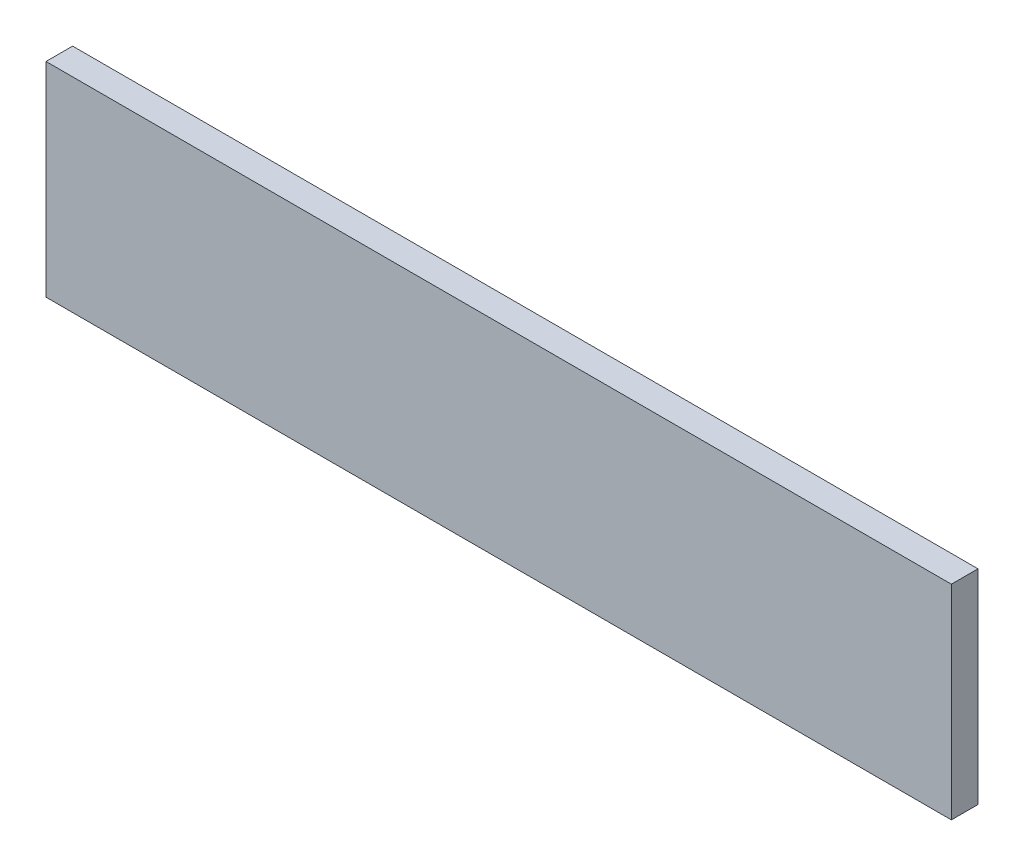
ISO-10303-21;
HEADER;
FILE_DESCRIPTION(('STEP AP214'),'2;1');
FILE_NAME('part.step','',(''),(''),'','','');
FILE_SCHEMA(('AUTOMOTIVE_DESIGN { 1 0 10303 214 1 1 1 1 }'));
ENDSEC;
DATA;
#1=APPLICATION_CONTEXT('core data for automotive mechanical design processes');
#2=APPLICATION_PROTOCOL_DEFINITION('international standard','automotive_design',2000,#1);
#3=PRODUCT_CONTEXT('',#1,'mechanical');
#4=PRODUCT('Part','Part','',(#3));
#5=PRODUCT_RELATED_PRODUCT_CATEGORY('part','',(#4));
#6=PRODUCT_DEFINITION_FORMATION('','',#4);
#7=PRODUCT_DEFINITION_CONTEXT('part definition',#1,'design');
#8=PRODUCT_DEFINITION('design','',#6,#7);
#9=PRODUCT_DEFINITION_SHAPE('','',#8);
#10=(LENGTH_UNIT() NAMED_UNIT(*) SI_UNIT(.MILLI.,.METRE.));
#11=(NAMED_UNIT(*) PLANE_ANGLE_UNIT() SI_UNIT($,.RADIAN.));
#12=(NAMED_UNIT(*) SI_UNIT($,.STERADIAN.) SOLID_ANGLE_UNIT());
#13=UNCERTAINTY_MEASURE_WITH_UNIT(LENGTH_MEASURE(1.E-05),#10,'distance_accuracy_value','');
#14=(GEOMETRIC_REPRESENTATION_CONTEXT(3) GLOBAL_UNCERTAINTY_ASSIGNED_CONTEXT((#13)) GLOBAL_UNIT_ASSIGNED_CONTEXT((#10,
#11,#12)) REPRESENTATION_CONTEXT('',''));
#15=CARTESIAN_POINT('',(0.,0.,0.));
#16=DIRECTION('',(0.,0.,1.));
#17=DIRECTION('',(1.,0.,0.));
#18=AXIS2_PLACEMENT_3D('',#15,#16,#17);
#19=CARTESIAN_POINT('',(0.,0.,19.05));
#20=DIRECTION('',(1.,0.,0.));
#21=DIRECTION('',(0.,0.,-1.));
#22=AXIS2_PLACEMENT_3D('',#19,#20,#21);
#23=PLANE('',#22);
#24=DIRECTION('',(0.,-1.,0.));
#25=VECTOR('',#24,1.);
#26=CARTESIAN_POINT('',(0.,0.,0.));
#27=LINE('',#26,#25);
#28=CARTESIAN_POINT('',(0.,146.05,0.));
#29=VERTEX_POINT('',#28);
#30=CARTESIAN_POINT('',(0.,0.,0.));
#31=VERTEX_POINT('',#30);
#32=EDGE_CURVE('E96',#29,#31,#27,.T.);
#33=ORIENTED_EDGE('',*,*,#32,.T.);
#34=DIRECTION('',(0.,0.,-1.));
#35=VECTOR('',#34,1.);
#36=CARTESIAN_POINT('',(0.,0.,19.05));
#37=LINE('',#36,#35);
#38=CARTESIAN_POINT('',(0.,0.,19.05));
#39=VERTEX_POINT('',#38);
#40=EDGE_CURVE('E11',#39,#31,#37,.T.);
#41=ORIENTED_EDGE('',*,*,#40,.F.);
#42=DIRECTION('',(0.,-1.,0.));
#43=VECTOR('',#42,1.);
#44=CARTESIAN_POINT('',(0.,0.,19.05));
#45=LINE('',#44,#43);
#46=CARTESIAN_POINT('',(0.,146.05,19.05));
#47=VERTEX_POINT('',#46);
#48=EDGE_CURVE('E84',#47,#39,#45,.T.);
#49=ORIENTED_EDGE('',*,*,#48,.F.);
#50=DIRECTION('',(0.,0.,-1.));
#51=VECTOR('',#50,1.);
#52=CARTESIAN_POINT('',(0.,146.05,19.05));
#53=LINE('',#52,#51);
#54=EDGE_CURVE('E92',#47,#29,#53,.T.);
#55=ORIENTED_EDGE('',*,*,#54,.T.);
#56=EDGE_LOOP('',(#33,#41,#49,#55));
#57=FACE_BOUND('',#56,.T.);
#58=ADVANCED_FACE('F33',(#57),#23,.F.);
#59=CARTESIAN_POINT('',(0.,0.,19.05));
#60=DIRECTION('',(0.,1.,0.));
#61=DIRECTION('',(0.,0.,1.));
#62=AXIS2_PLACEMENT_3D('',#59,#60,#61);
#63=PLANE('',#62);
#64=DIRECTION('',(1.,0.,0.));
#65=VECTOR('',#64,1.);
#66=CARTESIAN_POINT('',(0.,0.,0.));
#67=LINE('',#66,#65);
#68=CARTESIAN_POINT('',(647.7,0.,0.));
#69=VERTEX_POINT('',#68);
#70=EDGE_CURVE('E88',#31,#69,#67,.T.);
#71=ORIENTED_EDGE('',*,*,#70,.T.);
#72=DIRECTION('',(0.,0.,-1.));
#73=VECTOR('',#72,1.);
#74=CARTESIAN_POINT('',(647.7,0.,19.05));
#75=LINE('',#74,#73);
#76=CARTESIAN_POINT('',(647.7,0.,19.05));
#77=VERTEX_POINT('',#76);
#78=EDGE_CURVE('E41',#77,#69,#75,.T.);
#79=ORIENTED_EDGE('',*,*,#78,.F.);
#80=DIRECTION('',(1.,0.,0.));
#81=VECTOR('',#80,1.);
#82=CARTESIAN_POINT('',(0.,0.,19.05));
#83=LINE('',#82,#81);
#84=EDGE_CURVE('E79',#39,#77,#83,.T.);
#85=ORIENTED_EDGE('',*,*,#84,.F.);
#86=ORIENTED_EDGE('',*,*,#40,.T.);
#87=EDGE_LOOP('',(#71,#79,#85,#86));
#88=FACE_BOUND('',#87,.T.);
#89=ADVANCED_FACE('F87',(#88),#63,.F.);
#90=CARTESIAN_POINT('',(647.7,0.,19.05));
#91=DIRECTION('',(-1.,0.,0.));
#92=DIRECTION('',(0.,0.,1.));
#93=AXIS2_PLACEMENT_3D('',#90,#91,#92);
#94=PLANE('',#93);
#95=DIRECTION('',(0.,1.,0.));
#96=VECTOR('',#95,1.);
#97=CARTESIAN_POINT('',(647.7,0.,0.));
#98=LINE('',#97,#96);
#99=CARTESIAN_POINT('',(647.7,146.05,0.));
#100=VERTEX_POINT('',#99);
#101=EDGE_CURVE('E66',#69,#100,#98,.T.);
#102=ORIENTED_EDGE('',*,*,#101,.T.);
#103=DIRECTION('',(0.,0.,-1.));
#104=VECTOR('',#103,1.);
#105=CARTESIAN_POINT('',(647.7,146.05,19.05));
#106=LINE('',#105,#104);
#107=CARTESIAN_POINT('',(647.7,146.05,19.05));
#108=VERTEX_POINT('',#107);
#109=EDGE_CURVE('E89',#108,#100,#106,.T.);
#110=ORIENTED_EDGE('',*,*,#109,.F.);
#111=DIRECTION('',(0.,1.,0.));
#112=VECTOR('',#111,1.);
#113=CARTESIAN_POINT('',(647.7,0.,19.05));
#114=LINE('',#113,#112);
#115=EDGE_CURVE('E82',#77,#108,#114,.T.);
#116=ORIENTED_EDGE('',*,*,#115,.F.);
#117=ORIENTED_EDGE('',*,*,#78,.T.);
#118=EDGE_LOOP('',(#102,#110,#116,#117));
#119=FACE_BOUND('',#118,.T.);
#120=ADVANCED_FACE('F90',(#119),#94,.F.);
#121=CARTESIAN_POINT('',(0.,146.05,19.05));
#122=DIRECTION('',(0.,-1.,0.));
#123=DIRECTION('',(0.,0.,-1.));
#124=AXIS2_PLACEMENT_3D('',#121,#122,#123);
#125=PLANE('',#124);
#126=DIRECTION('',(-1.,0.,0.));
#127=VECTOR('',#126,1.);
#128=CARTESIAN_POINT('',(0.,146.05,0.));
#129=LINE('',#128,#127);
#130=EDGE_CURVE('E72',#100,#29,#129,.T.);
#131=ORIENTED_EDGE('',*,*,#130,.T.);
#132=ORIENTED_EDGE('',*,*,#54,.F.);
#133=DIRECTION('',(-1.,0.,0.));
#134=VECTOR('',#133,1.);
#135=CARTESIAN_POINT('',(0.,146.05,19.05));
#136=LINE('',#135,#134);
#137=EDGE_CURVE('E49',#108,#47,#136,.T.);
#138=ORIENTED_EDGE('',*,*,#137,.F.);
#139=ORIENTED_EDGE('',*,*,#109,.T.);
#140=EDGE_LOOP('',(#131,#132,#138,#139));
#141=FACE_BOUND('',#140,.T.);
#142=ADVANCED_FACE('F103',(#141),#125,.F.);
#143=CARTESIAN_POINT('',(0.,0.,19.05));
#144=DIRECTION('',(0.,0.,-1.));
#145=DIRECTION('',(-1.,0.,0.));
#146=AXIS2_PLACEMENT_3D('',#143,#144,#145);
#147=PLANE('',#146);
#148=ORIENTED_EDGE('',*,*,#48,.T.);
#149=ORIENTED_EDGE('',*,*,#84,.T.);
#150=ORIENTED_EDGE('',*,*,#115,.T.);
#151=ORIENTED_EDGE('',*,*,#137,.T.);
#152=EDGE_LOOP('',(#148,#149,#150,#151));
#153=FACE_BOUND('',#152,.T.);
#154=ADVANCED_FACE('F80',(#153),#147,.F.);
#155=CARTESIAN_POINT('',(0.,0.,0.));
#156=DIRECTION('',(0.,0.,-1.));
#157=DIRECTION('',(-1.,0.,0.));
#158=AXIS2_PLACEMENT_3D('',#155,#156,#157);
#159=PLANE('',#158);
#160=ORIENTED_EDGE('',*,*,#32,.F.);
#161=ORIENTED_EDGE('',*,*,#130,.F.);
#162=ORIENTED_EDGE('',*,*,#101,.F.);
#163=ORIENTED_EDGE('',*,*,#70,.F.);
#164=EDGE_LOOP('',(#160,#161,#162,#163));
#165=FACE_BOUND('',#164,.T.);
#166=ADVANCED_FACE('F106',(#165),#159,.T.);
#167=CLOSED_SHELL('',(#58,#89,#120,#142,#154,#166));
#168=MANIFOLD_SOLID_BREP('B2',#167);
#169=ADVANCED_BREP_SHAPE_REPRESENTATION('',(#18,#168),#14);
#170=SHAPE_DEFINITION_REPRESENTATION(#9,#169);
ENDSEC;
END-ISO-10303-21;
